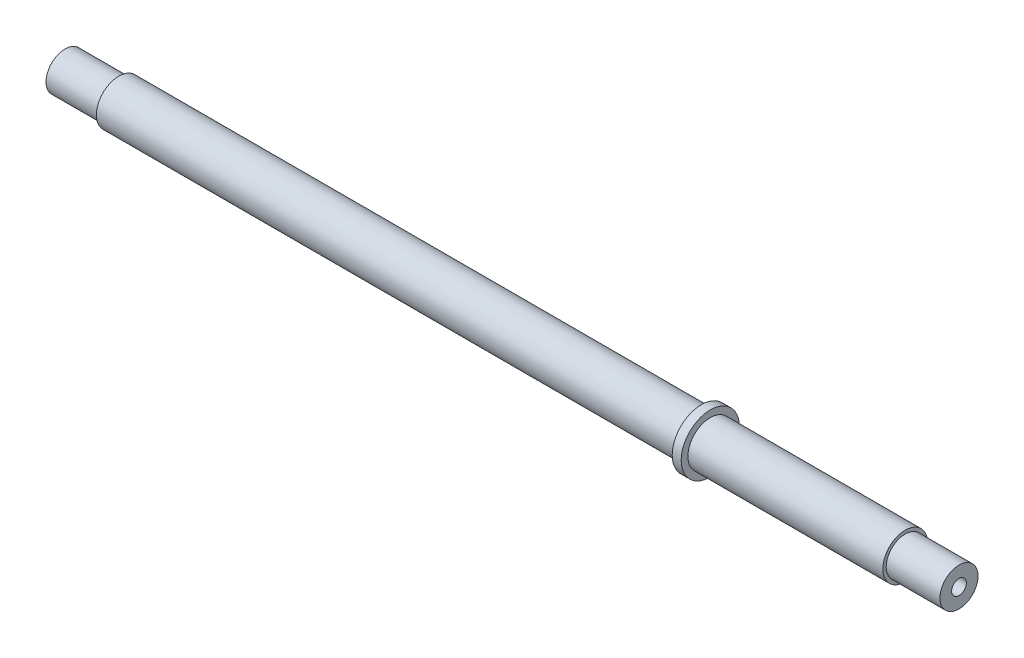
ISO-10303-21;
HEADER;
FILE_DESCRIPTION(('STEP AP214'),'2;1');
FILE_NAME('part.step','',(''),(''),'','','');
FILE_SCHEMA(('AUTOMOTIVE_DESIGN { 1 0 10303 214 1 1 1 1 }'));
ENDSEC;
DATA;
#1=APPLICATION_CONTEXT('core data for automotive mechanical design processes');
#2=APPLICATION_PROTOCOL_DEFINITION('international standard','automotive_design',2000,#1);
#3=PRODUCT_CONTEXT('',#1,'mechanical');
#4=PRODUCT('Part','Part','',(#3));
#5=PRODUCT_RELATED_PRODUCT_CATEGORY('part','',(#4));
#6=PRODUCT_DEFINITION_FORMATION('','',#4);
#7=PRODUCT_DEFINITION_CONTEXT('part definition',#1,'design');
#8=PRODUCT_DEFINITION('design','',#6,#7);
#9=PRODUCT_DEFINITION_SHAPE('','',#8);
#10=(LENGTH_UNIT() NAMED_UNIT(*) SI_UNIT(.MILLI.,.METRE.));
#11=(NAMED_UNIT(*) PLANE_ANGLE_UNIT() SI_UNIT($,.RADIAN.));
#12=(NAMED_UNIT(*) SI_UNIT($,.STERADIAN.) SOLID_ANGLE_UNIT());
#13=UNCERTAINTY_MEASURE_WITH_UNIT(LENGTH_MEASURE(1.E-05),#10,'distance_accuracy_value','');
#14=(GEOMETRIC_REPRESENTATION_CONTEXT(3) GLOBAL_UNCERTAINTY_ASSIGNED_CONTEXT((#13)) GLOBAL_UNIT_ASSIGNED_CONTEXT((#10,
#11,#12)) REPRESENTATION_CONTEXT('',''));
#15=CARTESIAN_POINT('',(0.,0.,0.));
#16=DIRECTION('',(0.,0.,1.));
#17=DIRECTION('',(1.,0.,0.));
#18=AXIS2_PLACEMENT_3D('',#15,#16,#17);
#19=CARTESIAN_POINT('',(-99.75,0.,-1.22218464803367E-11));
#20=DIRECTION('',(1.,0.,0.));
#21=DIRECTION('',(0.,0.,-1.));
#22=AXIS2_PLACEMENT_3D('',#19,#20,#21);
#23=PLANE('',#22);
#24=CARTESIAN_POINT('',(-99.75,0.,0.));
#25=DIRECTION('',(-1.,0.,0.));
#26=DIRECTION('',(0.,0.,1.));
#27=AXIS2_PLACEMENT_3D('',#24,#25,#26);
#28=CIRCLE('',#27,1.64999999999999);
#29=CARTESIAN_POINT('',(-99.75,0.,1.64999999999999));
#30=VERTEX_POINT('',#29);
#31=EDGE_CURVE('E63',#30,#30,#28,.T.);
#32=ORIENTED_EDGE('',*,*,#31,.F.);
#33=EDGE_LOOP('',(#32));
#34=FACE_BOUND('',#33,.T.);
#35=CARTESIAN_POINT('',(-99.75,0.,0.));
#36=DIRECTION('',(-1.,0.,0.));
#37=DIRECTION('',(0.,0.,1.));
#38=AXIS2_PLACEMENT_3D('',#35,#36,#37);
#39=CIRCLE('',#38,4.25000000001222);
#40=CARTESIAN_POINT('',(-99.75,0.,4.25000000001222));
#41=VERTEX_POINT('',#40);
#42=EDGE_CURVE('E11',#41,#41,#39,.T.);
#43=ORIENTED_EDGE('',*,*,#42,.T.);
#44=EDGE_LOOP('',(#43));
#45=FACE_BOUND('',#44,.T.);
#46=ADVANCED_FACE('F39',(#34,#45),#23,.F.);
#47=CARTESIAN_POINT('',(-69.6099034962822,0.,0.));
#48=DIRECTION('',(-1.,0.,0.));
#49=DIRECTION('',(0.,0.,1.));
#50=AXIS2_PLACEMENT_3D('',#47,#48,#49);
#51=CYLINDRICAL_SURFACE('',#50,4.25000000001222);
#52=ORIENTED_EDGE('',*,*,#42,.F.);
#53=EDGE_LOOP('',(#52));
#54=FACE_BOUND('',#53,.T.);
#55=CARTESIAN_POINT('',(-87.75,0.,0.));
#56=DIRECTION('',(-1.,0.,0.));
#57=DIRECTION('',(0.,0.,1.));
#58=AXIS2_PLACEMENT_3D('',#55,#56,#57);
#59=CIRCLE('',#58,4.25000000001222);
#60=CARTESIAN_POINT('',(-87.75,0.,4.25000000001222));
#61=VERTEX_POINT('',#60);
#62=EDGE_CURVE('E46',#61,#61,#59,.T.);
#63=ORIENTED_EDGE('',*,*,#62,.T.);
#64=EDGE_LOOP('',(#63));
#65=FACE_BOUND('',#64,.T.);
#66=ADVANCED_FACE('F99',(#54,#65),#51,.T.);
#67=CARTESIAN_POINT('',(-87.75,0.,-4.25000000001222));
#68=DIRECTION('',(1.,0.,0.));
#69=DIRECTION('',(0.,0.,-1.));
#70=AXIS2_PLACEMENT_3D('',#67,#68,#69);
#71=PLANE('',#70);
#72=ORIENTED_EDGE('',*,*,#62,.F.);
#73=EDGE_LOOP('',(#72));
#74=FACE_BOUND('',#73,.T.);
#75=CARTESIAN_POINT('',(-87.75,0.,0.));
#76=DIRECTION('',(-1.,0.,0.));
#77=DIRECTION('',(0.,0.,1.));
#78=AXIS2_PLACEMENT_3D('',#75,#76,#77);
#79=CIRCLE('',#78,5.00000000001222);
#80=CARTESIAN_POINT('',(-87.75,0.,5.00000000001222));
#81=VERTEX_POINT('',#80);
#82=EDGE_CURVE('E94',#81,#81,#79,.T.);
#83=ORIENTED_EDGE('',*,*,#82,.T.);
#84=EDGE_LOOP('',(#83));
#85=FACE_BOUND('',#84,.T.);
#86=ADVANCED_FACE('F101',(#74,#85),#71,.F.);
#87=CARTESIAN_POINT('',(-69.6099034962822,0.,0.));
#88=DIRECTION('',(-1.,0.,0.));
#89=DIRECTION('',(0.,0.,1.));
#90=AXIS2_PLACEMENT_3D('',#87,#88,#89);
#91=CYLINDRICAL_SURFACE('',#90,5.00000000001222);
#92=ORIENTED_EDGE('',*,*,#82,.F.);
#93=EDGE_LOOP('',(#92));
#94=FACE_BOUND('',#93,.T.);
#95=CARTESIAN_POINT('',(42.25,0.,0.));
#96=DIRECTION('',(-1.,0.,0.));
#97=DIRECTION('',(0.,0.,1.));
#98=AXIS2_PLACEMENT_3D('',#95,#96,#97);
#99=CIRCLE('',#98,5.00000000001222);
#100=CARTESIAN_POINT('',(42.25,0.,5.00000000001222));
#101=VERTEX_POINT('',#100);
#102=EDGE_CURVE('E91',#101,#101,#99,.T.);
#103=ORIENTED_EDGE('',*,*,#102,.T.);
#104=EDGE_LOOP('',(#103));
#105=FACE_BOUND('',#104,.T.);
#106=ADVANCED_FACE('F104',(#94,#105),#91,.T.);
#107=CARTESIAN_POINT('',(42.25,0.,-5.00000000001222));
#108=DIRECTION('',(1.,0.,0.));
#109=DIRECTION('',(0.,0.,-1.));
#110=AXIS2_PLACEMENT_3D('',#107,#108,#109);
#111=PLANE('',#110);
#112=ORIENTED_EDGE('',*,*,#102,.F.);
#113=EDGE_LOOP('',(#112));
#114=FACE_BOUND('',#113,.T.);
#115=CARTESIAN_POINT('',(42.25,0.,0.));
#116=DIRECTION('',(-1.,0.,0.));
#117=DIRECTION('',(0.,0.,1.));
#118=AXIS2_PLACEMENT_3D('',#115,#116,#117);
#119=CIRCLE('',#118,6.50000000001222);
#120=CARTESIAN_POINT('',(42.25,0.,6.50000000001222));
#121=VERTEX_POINT('',#120);
#122=EDGE_CURVE('E88',#121,#121,#119,.T.);
#123=ORIENTED_EDGE('',*,*,#122,.T.);
#124=EDGE_LOOP('',(#123));
#125=FACE_BOUND('',#124,.T.);
#126=ADVANCED_FACE('F110',(#114,#125),#111,.F.);
#127=CARTESIAN_POINT('',(-69.6099034962822,0.,0.));
#128=DIRECTION('',(-1.,0.,0.));
#129=DIRECTION('',(0.,0.,1.));
#130=AXIS2_PLACEMENT_3D('',#127,#128,#129);
#131=CYLINDRICAL_SURFACE('',#130,6.50000000001222);
#132=ORIENTED_EDGE('',*,*,#122,.F.);
#133=EDGE_LOOP('',(#132));
#134=FACE_BOUND('',#133,.T.);
#135=CARTESIAN_POINT('',(44.25,0.,0.));
#136=DIRECTION('',(-1.,0.,0.));
#137=DIRECTION('',(0.,0.,1.));
#138=AXIS2_PLACEMENT_3D('',#135,#136,#137);
#139=CIRCLE('',#138,6.50000000001222);
#140=CARTESIAN_POINT('',(44.25,0.,6.50000000001222));
#141=VERTEX_POINT('',#140);
#142=EDGE_CURVE('E85',#141,#141,#139,.T.);
#143=ORIENTED_EDGE('',*,*,#142,.T.);
#144=EDGE_LOOP('',(#143));
#145=FACE_BOUND('',#144,.T.);
#146=ADVANCED_FACE('F116',(#134,#145),#131,.T.);
#147=CARTESIAN_POINT('',(44.25,0.,-6.50000000001222));
#148=DIRECTION('',(-1.,0.,0.));
#149=DIRECTION('',(0.,0.,1.));
#150=AXIS2_PLACEMENT_3D('',#147,#148,#149);
#151=PLANE('',#150);
#152=ORIENTED_EDGE('',*,*,#142,.F.);
#153=EDGE_LOOP('',(#152));
#154=FACE_BOUND('',#153,.T.);
#155=CARTESIAN_POINT('',(44.25,0.,0.));
#156=DIRECTION('',(-1.,0.,0.));
#157=DIRECTION('',(0.,0.,1.));
#158=AXIS2_PLACEMENT_3D('',#155,#156,#157);
#159=CIRCLE('',#158,5.00000000001222);
#160=CARTESIAN_POINT('',(44.25,0.,5.00000000001222));
#161=VERTEX_POINT('',#160);
#162=EDGE_CURVE('E82',#161,#161,#159,.T.);
#163=ORIENTED_EDGE('',*,*,#162,.T.);
#164=EDGE_LOOP('',(#163));
#165=FACE_BOUND('',#164,.T.);
#166=ADVANCED_FACE('F122',(#154,#165),#151,.F.);
#167=CARTESIAN_POINT('',(-69.6099034962822,0.,0.));
#168=DIRECTION('',(-1.,0.,0.));
#169=DIRECTION('',(0.,0.,1.));
#170=AXIS2_PLACEMENT_3D('',#167,#168,#169);
#171=CYLINDRICAL_SURFACE('',#170,5.00000000001224);
#172=ORIENTED_EDGE('',*,*,#162,.F.);
#173=EDGE_LOOP('',(#172));
#174=FACE_BOUND('',#173,.T.);
#175=CARTESIAN_POINT('',(87.75,0.,0.));
#176=DIRECTION('',(-1.,0.,0.));
#177=DIRECTION('',(0.,0.,1.));
#178=AXIS2_PLACEMENT_3D('',#175,#176,#177);
#179=CIRCLE('',#178,5.00000000001226);
#180=CARTESIAN_POINT('',(87.75,0.,5.00000000001226));
#181=VERTEX_POINT('',#180);
#182=EDGE_CURVE('E79',#181,#181,#179,.T.);
#183=ORIENTED_EDGE('',*,*,#182,.T.);
#184=EDGE_LOOP('',(#183));
#185=FACE_BOUND('',#184,.T.);
#186=ADVANCED_FACE('F128',(#174,#185),#171,.T.);
#187=CARTESIAN_POINT('',(87.75,0.,-5.00000000001226));
#188=DIRECTION('',(-1.,0.,0.));
#189=DIRECTION('',(0.,0.,1.));
#190=AXIS2_PLACEMENT_3D('',#187,#188,#189);
#191=PLANE('',#190);
#192=ORIENTED_EDGE('',*,*,#182,.F.);
#193=EDGE_LOOP('',(#192));
#194=FACE_BOUND('',#193,.T.);
#195=CARTESIAN_POINT('',(87.75,0.,0.));
#196=DIRECTION('',(-1.,0.,0.));
#197=DIRECTION('',(0.,0.,1.));
#198=AXIS2_PLACEMENT_3D('',#195,#196,#197);
#199=CIRCLE('',#198,4.25000000001222);
#200=CARTESIAN_POINT('',(87.75,0.,4.25000000001222));
#201=VERTEX_POINT('',#200);
#202=EDGE_CURVE('E76',#201,#201,#199,.T.);
#203=ORIENTED_EDGE('',*,*,#202,.T.);
#204=EDGE_LOOP('',(#203));
#205=FACE_BOUND('',#204,.T.);
#206=ADVANCED_FACE('F134',(#194,#205),#191,.F.);
#207=CARTESIAN_POINT('',(-69.6099034962822,0.,0.));
#208=DIRECTION('',(-1.,0.,0.));
#209=DIRECTION('',(0.,0.,1.));
#210=AXIS2_PLACEMENT_3D('',#207,#208,#209);
#211=CYLINDRICAL_SURFACE('',#210,4.25000000001222);
#212=ORIENTED_EDGE('',*,*,#202,.F.);
#213=EDGE_LOOP('',(#212));
#214=FACE_BOUND('',#213,.T.);
#215=CARTESIAN_POINT('',(99.75,0.,0.));
#216=DIRECTION('',(-1.,0.,0.));
#217=DIRECTION('',(0.,0.,1.));
#218=AXIS2_PLACEMENT_3D('',#215,#216,#217);
#219=CIRCLE('',#218,4.25000000001222);
#220=CARTESIAN_POINT('',(99.75,0.,4.25000000001222));
#221=VERTEX_POINT('',#220);
#222=EDGE_CURVE('E73',#221,#221,#219,.T.);
#223=ORIENTED_EDGE('',*,*,#222,.T.);
#224=EDGE_LOOP('',(#223));
#225=FACE_BOUND('',#224,.T.);
#226=ADVANCED_FACE('F140',(#214,#225),#211,.T.);
#227=CARTESIAN_POINT('',(99.75,0.,-4.25000000001222));
#228=DIRECTION('',(-1.,0.,0.));
#229=DIRECTION('',(0.,0.,1.));
#230=AXIS2_PLACEMENT_3D('',#227,#228,#229);
#231=PLANE('',#230);
#232=CARTESIAN_POINT('',(99.75,0.,0.));
#233=DIRECTION('',(1.,0.,0.));
#234=DIRECTION('',(0.,0.,-1.));
#235=AXIS2_PLACEMENT_3D('',#232,#233,#234);
#236=CIRCLE('',#235,1.64999999999999);
#237=CARTESIAN_POINT('',(99.75,0.,-1.64999999999999));
#238=VERTEX_POINT('',#237);
#239=EDGE_CURVE('E62',#238,#238,#236,.T.);
#240=ORIENTED_EDGE('',*,*,#239,.F.);
#241=EDGE_LOOP('',(#240));
#242=FACE_BOUND('',#241,.T.);
#243=ORIENTED_EDGE('',*,*,#222,.F.);
#244=EDGE_LOOP('',(#243));
#245=FACE_BOUND('',#244,.T.);
#246=ADVANCED_FACE('F146',(#242,#245),#231,.F.);
#247=CARTESIAN_POINT('',(84.75,0.,0.));
#248=DIRECTION('',(1.,0.,0.));
#249=DIRECTION('',(0.,0.,-1.));
#250=AXIS2_PLACEMENT_3D('',#247,#248,#249);
#251=CONICAL_SURFACE('',#250,1.64999999999999,1.02974425867665);
#252=CARTESIAN_POINT('',(83.7585799786045,0.,0.));
#253=VERTEX_POINT('',#252);
#254=VERTEX_LOOP('',#253);
#255=FACE_BOUND('',#254,.T.);
#256=CARTESIAN_POINT('',(84.75,0.,0.));
#257=DIRECTION('',(1.,0.,0.));
#258=DIRECTION('',(0.,0.,-1.));
#259=AXIS2_PLACEMENT_3D('',#256,#257,#258);
#260=CIRCLE('',#259,1.64999999999999);
#261=CARTESIAN_POINT('',(84.75,0.,-1.64999999999999));
#262=VERTEX_POINT('',#261);
#263=EDGE_CURVE('E66',#262,#262,#260,.T.);
#264=ORIENTED_EDGE('',*,*,#263,.T.);
#265=EDGE_LOOP('',(#264));
#266=FACE_BOUND('',#265,.T.);
#267=ADVANCED_FACE('F151',(#255,#266),#251,.F.);
#268=CARTESIAN_POINT('',(99.75,0.,0.));
#269=DIRECTION('',(1.,0.,0.));
#270=DIRECTION('',(0.,0.,-1.));
#271=AXIS2_PLACEMENT_3D('',#268,#269,#270);
#272=CYLINDRICAL_SURFACE('',#271,1.64999999999999);
#273=ORIENTED_EDGE('',*,*,#263,.F.);
#274=EDGE_LOOP('',(#273));
#275=FACE_BOUND('',#274,.T.);
#276=ORIENTED_EDGE('',*,*,#239,.T.);
#277=EDGE_LOOP('',(#276));
#278=FACE_BOUND('',#277,.T.);
#279=ADVANCED_FACE('F56',(#275,#278),#272,.F.);
#280=CARTESIAN_POINT('',(-84.75,0.,0.));
#281=DIRECTION('',(-1.,0.,0.));
#282=DIRECTION('',(0.,0.,1.));
#283=AXIS2_PLACEMENT_3D('',#280,#281,#282);
#284=CONICAL_SURFACE('',#283,1.64999999999999,1.02974425867665);
#285=CARTESIAN_POINT('',(-83.7585799786045,0.,0.));
#286=VERTEX_POINT('',#285);
#287=VERTEX_LOOP('',#286);
#288=FACE_BOUND('',#287,.T.);
#289=CARTESIAN_POINT('',(-84.75,0.,0.));
#290=DIRECTION('',(-1.,0.,0.));
#291=DIRECTION('',(0.,0.,1.));
#292=AXIS2_PLACEMENT_3D('',#289,#290,#291);
#293=CIRCLE('',#292,1.64999999999999);
#294=CARTESIAN_POINT('',(-84.75,0.,1.64999999999999));
#295=VERTEX_POINT('',#294);
#296=EDGE_CURVE('E60',#295,#295,#293,.T.);
#297=ORIENTED_EDGE('',*,*,#296,.T.);
#298=EDGE_LOOP('',(#297));
#299=FACE_BOUND('',#298,.T.);
#300=ADVANCED_FACE('F52',(#288,#299),#284,.F.);
#301=CARTESIAN_POINT('',(-99.75,0.,0.));
#302=DIRECTION('',(-1.,0.,0.));
#303=DIRECTION('',(0.,0.,1.));
#304=AXIS2_PLACEMENT_3D('',#301,#302,#303);
#305=CYLINDRICAL_SURFACE('',#304,1.64999999999999);
#306=ORIENTED_EDGE('',*,*,#296,.F.);
#307=EDGE_LOOP('',(#306));
#308=FACE_BOUND('',#307,.T.);
#309=ORIENTED_EDGE('',*,*,#31,.T.);
#310=EDGE_LOOP('',(#309));
#311=FACE_BOUND('',#310,.T.);
#312=ADVANCED_FACE('F55',(#308,#311),#305,.F.);
#313=CLOSED_SHELL('',(#46,#66,#86,#106,#126,#146,#166,#186,#206,#226,#246,#267,#279,#300,#312));
#314=MANIFOLD_SOLID_BREP('B2',#313);
#315=ADVANCED_BREP_SHAPE_REPRESENTATION('',(#18,#314),#14);
#316=SHAPE_DEFINITION_REPRESENTATION(#9,#315);
ENDSEC;
END-ISO-10303-21;
